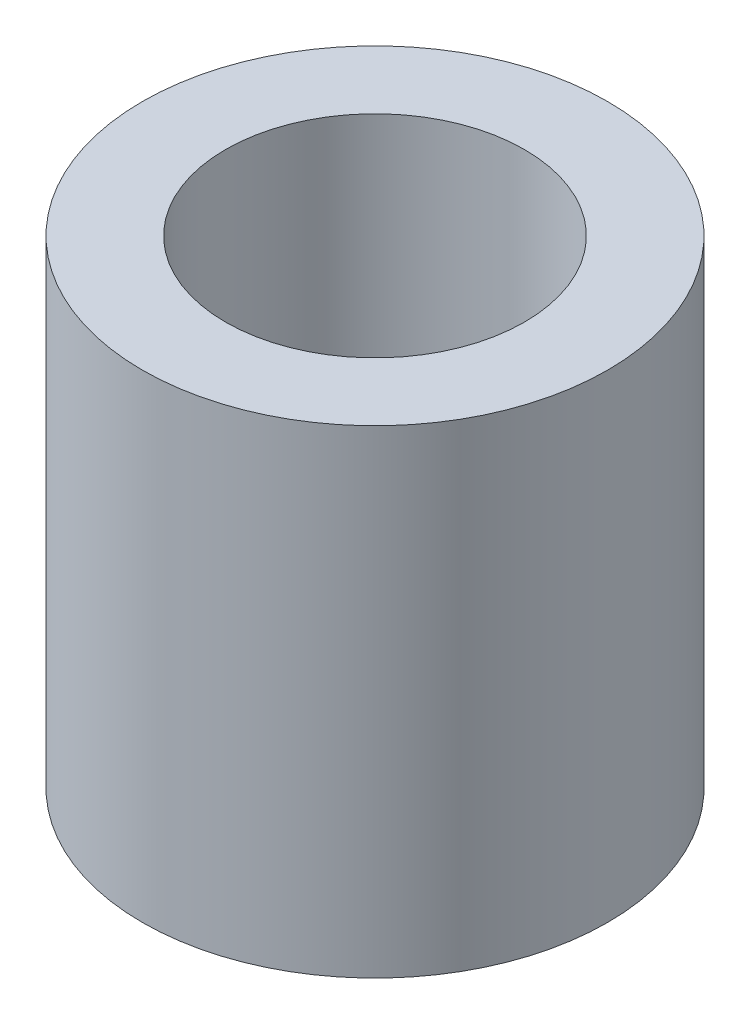
ISO-10303-21;
HEADER;
FILE_DESCRIPTION(('STEP AP214'),'2;1');
FILE_NAME('part.step','',(''),(''),'','','');
FILE_SCHEMA(('AUTOMOTIVE_DESIGN { 1 0 10303 214 1 1 1 1 }'));
ENDSEC;
DATA;
#1=APPLICATION_CONTEXT('core data for automotive mechanical design processes');
#2=APPLICATION_PROTOCOL_DEFINITION('international standard','automotive_design',2000,#1);
#3=PRODUCT_CONTEXT('',#1,'mechanical');
#4=PRODUCT('Part','Part','',(#3));
#5=PRODUCT_RELATED_PRODUCT_CATEGORY('part','',(#4));
#6=PRODUCT_DEFINITION_FORMATION('','',#4);
#7=PRODUCT_DEFINITION_CONTEXT('part definition',#1,'design');
#8=PRODUCT_DEFINITION('design','',#6,#7);
#9=PRODUCT_DEFINITION_SHAPE('','',#8);
#10=(LENGTH_UNIT() NAMED_UNIT(*) SI_UNIT(.MILLI.,.METRE.));
#11=(NAMED_UNIT(*) PLANE_ANGLE_UNIT() SI_UNIT($,.RADIAN.));
#12=(NAMED_UNIT(*) SI_UNIT($,.STERADIAN.) SOLID_ANGLE_UNIT());
#13=UNCERTAINTY_MEASURE_WITH_UNIT(LENGTH_MEASURE(1.E-05),#10,'distance_accuracy_value','');
#14=(GEOMETRIC_REPRESENTATION_CONTEXT(3) GLOBAL_UNCERTAINTY_ASSIGNED_CONTEXT((#13)) GLOBAL_UNIT_ASSIGNED_CONTEXT((#10,
#11,#12)) REPRESENTATION_CONTEXT('',''));
#15=CARTESIAN_POINT('',(0.,0.,0.));
#16=DIRECTION('',(0.,0.,1.));
#17=DIRECTION('',(1.,0.,0.));
#18=AXIS2_PLACEMENT_3D('',#15,#16,#17);
#19=CARTESIAN_POINT('',(0.,5.08,0.));
#20=DIRECTION('',(0.,1.,0.));
#21=DIRECTION('',(0.,0.,1.));
#22=AXIS2_PLACEMENT_3D('',#19,#20,#21);
#23=PLANE('',#22);
#24=CARTESIAN_POINT('',(0.,5.08,0.));
#25=DIRECTION('',(0.,1.,0.));
#26=DIRECTION('',(0.,0.,1.));
#27=AXIS2_PLACEMENT_3D('',#24,#25,#26);
#28=CIRCLE('',#27,2.47043947165772);
#29=CARTESIAN_POINT('',(0.,5.08,2.47043947165772));
#30=VERTEX_POINT('',#29);
#31=EDGE_CURVE('E10',#30,#30,#28,.T.);
#32=ORIENTED_EDGE('',*,*,#31,.T.);
#33=EDGE_LOOP('',(#32));
#34=FACE_BOUND('',#33,.T.);
#35=CARTESIAN_POINT('',(0.,5.08,0.));
#36=DIRECTION('',(0.,1.,0.));
#37=DIRECTION('',(0.,0.,1.));
#38=AXIS2_PLACEMENT_3D('',#35,#36,#37);
#39=CIRCLE('',#38,1.5875);
#40=CARTESIAN_POINT('',(0.,5.08,1.5875));
#41=VERTEX_POINT('',#40);
#42=EDGE_CURVE('E56',#41,#41,#39,.T.);
#43=ORIENTED_EDGE('',*,*,#42,.F.);
#44=EDGE_LOOP('',(#43));
#45=FACE_BOUND('',#44,.T.);
#46=ADVANCED_FACE('F43',(#34,#45),#23,.T.);
#47=CARTESIAN_POINT('',(0.,0.,0.));
#48=DIRECTION('',(0.,1.,0.));
#49=DIRECTION('',(0.,0.,1.));
#50=AXIS2_PLACEMENT_3D('',#47,#48,#49);
#51=PLANE('',#50);
#52=CARTESIAN_POINT('',(0.,0.,0.));
#53=DIRECTION('',(0.,1.,0.));
#54=DIRECTION('',(0.,0.,1.));
#55=AXIS2_PLACEMENT_3D('',#52,#53,#54);
#56=CIRCLE('',#55,2.47043947165772);
#57=CARTESIAN_POINT('',(0.,0.,2.47043947165772));
#58=VERTEX_POINT('',#57);
#59=EDGE_CURVE('E47',#58,#58,#56,.T.);
#60=ORIENTED_EDGE('',*,*,#59,.F.);
#61=EDGE_LOOP('',(#60));
#62=FACE_BOUND('',#61,.T.);
#63=CARTESIAN_POINT('',(0.,0.,0.));
#64=DIRECTION('',(0.,1.,0.));
#65=DIRECTION('',(0.,0.,1.));
#66=AXIS2_PLACEMENT_3D('',#63,#64,#65);
#67=CIRCLE('',#66,1.5875);
#68=CARTESIAN_POINT('',(0.,0.,1.5875));
#69=VERTEX_POINT('',#68);
#70=EDGE_CURVE('E58',#69,#69,#67,.T.);
#71=ORIENTED_EDGE('',*,*,#70,.T.);
#72=EDGE_LOOP('',(#71));
#73=FACE_BOUND('',#72,.T.);
#74=ADVANCED_FACE('F70',(#62,#73),#51,.F.);
#75=CARTESIAN_POINT('',(0.,5.08,0.));
#76=DIRECTION('',(0.,-1.,0.));
#77=DIRECTION('',(0.,0.,-1.));
#78=AXIS2_PLACEMENT_3D('',#75,#76,#77);
#79=CYLINDRICAL_SURFACE('',#78,2.47043947165772);
#80=ORIENTED_EDGE('',*,*,#31,.F.);
#81=EDGE_LOOP('',(#80));
#82=FACE_BOUND('',#81,.T.);
#83=ORIENTED_EDGE('',*,*,#59,.T.);
#84=EDGE_LOOP('',(#83));
#85=FACE_BOUND('',#84,.T.);
#86=ADVANCED_FACE('F45',(#82,#85),#79,.T.);
#87=CARTESIAN_POINT('',(0.,5.08,0.));
#88=DIRECTION('',(0.,-1.,0.));
#89=DIRECTION('',(0.,0.,-1.));
#90=AXIS2_PLACEMENT_3D('',#87,#88,#89);
#91=CYLINDRICAL_SURFACE('',#90,1.5875);
#92=ORIENTED_EDGE('',*,*,#42,.T.);
#93=EDGE_LOOP('',(#92));
#94=FACE_BOUND('',#93,.T.);
#95=ORIENTED_EDGE('',*,*,#70,.F.);
#96=EDGE_LOOP('',(#95));
#97=FACE_BOUND('',#96,.T.);
#98=ADVANCED_FACE('F66',(#94,#97),#91,.F.);
#99=CLOSED_SHELL('',(#46,#74,#86,#98));
#100=MANIFOLD_SOLID_BREP('B2',#99);
#101=ADVANCED_BREP_SHAPE_REPRESENTATION('',(#18,#100),#14);
#102=SHAPE_DEFINITION_REPRESENTATION(#9,#101);
ENDSEC;
END-ISO-10303-21;
